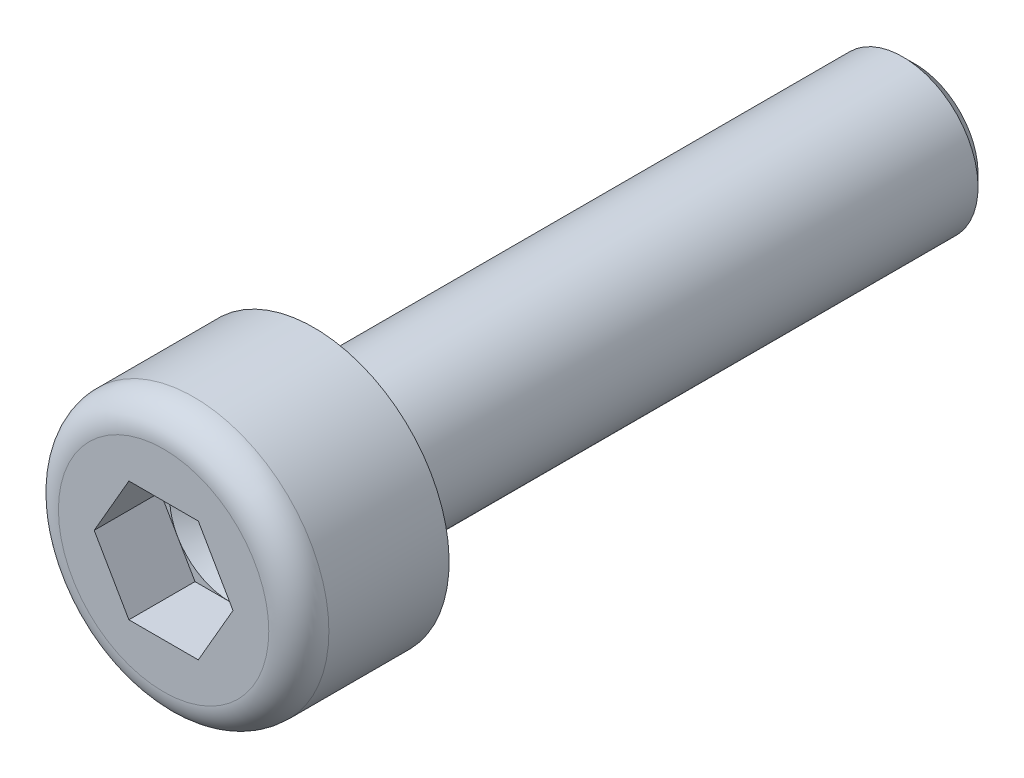
ISO-10303-21;
HEADER;
FILE_DESCRIPTION(('STEP AP214'),'2;1');
FILE_NAME('part.step','',(''),(''),'','','');
FILE_SCHEMA(('AUTOMOTIVE_DESIGN { 1 0 10303 214 1 1 1 1 }'));
ENDSEC;
DATA;
#1=APPLICATION_CONTEXT('core data for automotive mechanical design processes');
#2=APPLICATION_PROTOCOL_DEFINITION('international standard','automotive_design',2000,#1);
#3=PRODUCT_CONTEXT('',#1,'mechanical');
#4=PRODUCT('Part','Part','',(#3));
#5=PRODUCT_RELATED_PRODUCT_CATEGORY('part','',(#4));
#6=PRODUCT_DEFINITION_FORMATION('','',#4);
#7=PRODUCT_DEFINITION_CONTEXT('part definition',#1,'design');
#8=PRODUCT_DEFINITION('design','',#6,#7);
#9=PRODUCT_DEFINITION_SHAPE('','',#8);
#10=(LENGTH_UNIT() NAMED_UNIT(*) SI_UNIT(.MILLI.,.METRE.));
#11=(NAMED_UNIT(*) PLANE_ANGLE_UNIT() SI_UNIT($,.RADIAN.));
#12=(NAMED_UNIT(*) SI_UNIT($,.STERADIAN.) SOLID_ANGLE_UNIT());
#13=UNCERTAINTY_MEASURE_WITH_UNIT(LENGTH_MEASURE(1.E-05),#10,'distance_accuracy_value','');
#14=(GEOMETRIC_REPRESENTATION_CONTEXT(3) GLOBAL_UNCERTAINTY_ASSIGNED_CONTEXT((#13)) GLOBAL_UNIT_ASSIGNED_CONTEXT((#10,
#11,#12)) REPRESENTATION_CONTEXT('',''));
#15=CARTESIAN_POINT('',(0.,0.,0.));
#16=DIRECTION('',(0.,0.,1.));
#17=DIRECTION('',(1.,0.,0.));
#18=AXIS2_PLACEMENT_3D('',#15,#16,#17);
#19=CARTESIAN_POINT('',(0.,0.,-1.10000000000421));
#20=DIRECTION('',(0.,0.,1.));
#21=DIRECTION('',(0.,-1.,0.));
#22=AXIS2_PLACEMENT_3D('',#19,#20,#21);
#23=CONICAL_SURFACE('',#22,1.00000000000233,1.04719755119637);
#24=CARTESIAN_POINT('',(0.,1.11022302462516E-13,-1.67735026919519));
#25=VERTEX_POINT('',#24);
#26=VERTEX_LOOP('',#25);
#27=FACE_BOUND('',#26,.T.);
#28=CARTESIAN_POINT('',(0.,0.,-1.10000000000408));
#29=DIRECTION('',(0.,0.,1.));
#30=DIRECTION('',(0.,-1.,0.));
#31=AXIS2_PLACEMENT_3D('',#28,#29,#30);
#32=CIRCLE('',#31,1.00000000000255);
#33=CARTESIAN_POINT('',(0.,1.00000000000132,-1.10000000000204));
#34=VERTEX_POINT('',#33);
#35=CARTESIAN_POINT('',(0.866025403785388,0.500000000000646,-1.10000000000211));
#36=VERTEX_POINT('',#35);
#37=EDGE_CURVE('E84',#34,#36,#32,.F.);
#38=ORIENTED_EDGE('',*,*,#37,.F.);
#39=CARTESIAN_POINT('',(0.,0.,-1.10000000000408));
#40=DIRECTION('',(0.,0.,1.));
#41=DIRECTION('',(0.,-1.,0.));
#42=AXIS2_PLACEMENT_3D('',#39,#40,#41);
#43=CIRCLE('',#42,1.00000000000255);
#44=CARTESIAN_POINT('',(-0.866025403785583,0.500000000000678,-1.10000000000204));
#45=VERTEX_POINT('',#44);
#46=EDGE_CURVE('E141',#45,#34,#43,.F.);
#47=ORIENTED_EDGE('',*,*,#46,.F.);
#48=CARTESIAN_POINT('',(0.,0.,-1.10000000000408));
#49=DIRECTION('',(0.,0.,1.));
#50=DIRECTION('',(0.,-1.,0.));
#51=AXIS2_PLACEMENT_3D('',#48,#49,#50);
#52=CIRCLE('',#51,1.00000000000255);
#53=CARTESIAN_POINT('',(-0.866025403785612,-0.500000000000564,-1.10000000000204));
#54=VERTEX_POINT('',#53);
#55=EDGE_CURVE('E127',#54,#45,#52,.F.);
#56=ORIENTED_EDGE('',*,*,#55,.F.);
#57=CARTESIAN_POINT('',(0.,0.,-1.10000000000421));
#58=DIRECTION('',(0.,0.,1.));
#59=DIRECTION('',(0.,-1.,0.));
#60=AXIS2_PLACEMENT_3D('',#57,#58,#59);
#61=CIRCLE('',#60,1.00000000000233);
#62=CARTESIAN_POINT('',(0.,-1.00000000000116,-1.10000000000211));
#63=VERTEX_POINT('',#62);
#64=EDGE_CURVE('E143',#63,#54,#61,.F.);
#65=ORIENTED_EDGE('',*,*,#64,.F.);
#66=CARTESIAN_POINT('',(0.,0.,-1.10000000000421));
#67=DIRECTION('',(0.,0.,1.));
#68=DIRECTION('',(0.,-1.,0.));
#69=AXIS2_PLACEMENT_3D('',#66,#67,#68);
#70=CIRCLE('',#69,1.00000000000233);
#71=CARTESIAN_POINT('',(0.866025403785432,-0.500000000000564,-1.10000000000211));
#72=VERTEX_POINT('',#71);
#73=EDGE_CURVE('E90',#72,#63,#70,.F.);
#74=ORIENTED_EDGE('',*,*,#73,.F.);
#75=CARTESIAN_POINT('',(0.,0.,-1.10000000000421));
#76=DIRECTION('',(0.,0.,1.));
#77=DIRECTION('',(0.,-1.,0.));
#78=AXIS2_PLACEMENT_3D('',#75,#76,#77);
#79=CIRCLE('',#78,1.00000000000233);
#80=EDGE_CURVE('E87',#36,#72,#79,.F.);
#81=ORIENTED_EDGE('',*,*,#80,.F.);
#82=EDGE_LOOP('',(#38,#47,#56,#65,#74,#81));
#83=FACE_BOUND('',#82,.T.);
#84=ADVANCED_FACE('F17',(#27,#83),#23,.F.);
#85=CARTESIAN_POINT('',(0.,0.,-1.1));
#86=DIRECTION('',(0.,0.,1.));
#87=DIRECTION('',(0.,-1.,0.));
#88=AXIS2_PLACEMENT_3D('',#85,#86,#87);
#89=PLANE('',#88);
#90=ORIENTED_EDGE('',*,*,#37,.T.);
#91=DIRECTION('',(-0.5,0.866025403784439,0.));
#92=VECTOR('',#91,1.);
#93=CARTESIAN_POINT('',(1.15470053837918,0.,-1.1));
#94=LINE('',#93,#92);
#95=CARTESIAN_POINT('',(0.577350269189541,1.00000000000007,-1.1));
#96=VERTEX_POINT('',#95);
#97=EDGE_CURVE('E103',#36,#96,#94,.T.);
#98=ORIENTED_EDGE('',*,*,#97,.T.);
#99=DIRECTION('',(-1.,0.,0.));
#100=VECTOR('',#99,1.);
#101=CARTESIAN_POINT('',(0.57735026918956,1.00000000000008,-1.1));
#102=LINE('',#101,#100);
#103=EDGE_CURVE('E109',#96,#34,#102,.T.);
#104=ORIENTED_EDGE('',*,*,#103,.T.);
#105=EDGE_LOOP('',(#90,#98,#104));
#106=FACE_BOUND('',#105,.T.);
#107=ADVANCED_FACE('F107',(#106),#89,.T.);
#108=CARTESIAN_POINT('',(0.,0.,-1.1));
#109=DIRECTION('',(0.,0.,1.));
#110=DIRECTION('',(0.,-1.,0.));
#111=AXIS2_PLACEMENT_3D('',#108,#109,#110);
#112=PLANE('',#111);
#113=ORIENTED_EDGE('',*,*,#80,.T.);
#114=DIRECTION('',(0.500000000000001,0.866025403784438,0.));
#115=VECTOR('',#114,1.);
#116=CARTESIAN_POINT('',(0.577350269189581,-0.99999999999998,-1.1));
#117=LINE('',#116,#115);
#118=CARTESIAN_POINT('',(1.1547005383792,0.,-1.1));
#119=VERTEX_POINT('',#118);
#120=EDGE_CURVE('E98',#72,#119,#117,.T.);
#121=ORIENTED_EDGE('',*,*,#120,.T.);
#122=DIRECTION('',(-0.5,0.866025403784439,0.));
#123=VECTOR('',#122,1.);
#124=CARTESIAN_POINT('',(1.15470053837918,0.,-1.1));
#125=LINE('',#124,#123);
#126=EDGE_CURVE('E96',#119,#36,#125,.T.);
#127=ORIENTED_EDGE('',*,*,#126,.T.);
#128=EDGE_LOOP('',(#113,#121,#127));
#129=FACE_BOUND('',#128,.T.);
#130=ADVANCED_FACE('F97',(#129),#112,.T.);
#131=CARTESIAN_POINT('',(0.,0.,-1.1));
#132=DIRECTION('',(0.,0.,1.));
#133=DIRECTION('',(0.,-1.,0.));
#134=AXIS2_PLACEMENT_3D('',#131,#132,#133);
#135=PLANE('',#134);
#136=ORIENTED_EDGE('',*,*,#73,.T.);
#137=DIRECTION('',(1.,0.,0.));
#138=VECTOR('',#137,1.);
#139=CARTESIAN_POINT('',(-0.577350269189668,-0.99999999999999,-1.1));
#140=LINE('',#139,#138);
#141=CARTESIAN_POINT('',(0.577350269189588,-0.999999999999983,-1.1));
#142=VERTEX_POINT('',#141);
#143=EDGE_CURVE('E249',#63,#142,#140,.T.);
#144=ORIENTED_EDGE('',*,*,#143,.T.);
#145=DIRECTION('',(0.500000000000001,0.866025403784438,0.));
#146=VECTOR('',#145,1.);
#147=CARTESIAN_POINT('',(0.577350269189581,-0.99999999999998,-1.1));
#148=LINE('',#147,#146);
#149=EDGE_CURVE('E118',#142,#72,#148,.T.);
#150=ORIENTED_EDGE('',*,*,#149,.T.);
#151=EDGE_LOOP('',(#136,#144,#150));
#152=FACE_BOUND('',#151,.T.);
#153=ADVANCED_FACE('F302',(#152),#135,.T.);
#154=CARTESIAN_POINT('',(0.,0.,-1.1));
#155=DIRECTION('',(0.,0.,1.));
#156=DIRECTION('',(0.,-1.,0.));
#157=AXIS2_PLACEMENT_3D('',#154,#155,#156);
#158=PLANE('',#157);
#159=ORIENTED_EDGE('',*,*,#64,.T.);
#160=DIRECTION('',(0.499999999999999,-0.866025403784439,0.));
#161=VECTOR('',#160,1.);
#162=CARTESIAN_POINT('',(-1.15470053837933,0.,-1.1));
#163=LINE('',#162,#161);
#164=CARTESIAN_POINT('',(-0.577350269189676,-0.999999999999993,-1.1));
#165=VERTEX_POINT('',#164);
#166=EDGE_CURVE('E219',#54,#165,#163,.T.);
#167=ORIENTED_EDGE('',*,*,#166,.T.);
#168=DIRECTION('',(1.,0.,0.));
#169=VECTOR('',#168,1.);
#170=CARTESIAN_POINT('',(-0.577350269189668,-0.99999999999999,-1.1));
#171=LINE('',#170,#169);
#172=EDGE_CURVE('E246',#165,#63,#171,.T.);
#173=ORIENTED_EDGE('',*,*,#172,.T.);
#174=EDGE_LOOP('',(#159,#167,#173));
#175=FACE_BOUND('',#174,.T.);
#176=ADVANCED_FACE('F297',(#175),#158,.T.);
#177=CARTESIAN_POINT('',(0.,0.,-1.1));
#178=DIRECTION('',(0.,0.,1.));
#179=DIRECTION('',(0.,-1.,0.));
#180=AXIS2_PLACEMENT_3D('',#177,#178,#179);
#181=PLANE('',#180);
#182=ORIENTED_EDGE('',*,*,#46,.T.);
#183=DIRECTION('',(-1.,0.,0.));
#184=VECTOR('',#183,1.);
#185=CARTESIAN_POINT('',(0.57735026918956,1.00000000000008,-1.1));
#186=LINE('',#185,#184);
#187=CARTESIAN_POINT('',(-0.57735026918971,1.00000000000008,-1.1));
#188=VERTEX_POINT('',#187);
#189=EDGE_CURVE('E104',#34,#188,#186,.T.);
#190=ORIENTED_EDGE('',*,*,#189,.T.);
#191=DIRECTION('',(-0.5,-0.866025403784439,0.));
#192=VECTOR('',#191,1.);
#193=CARTESIAN_POINT('',(-0.57735026918972,1.00000000000005,-1.1));
#194=LINE('',#193,#192);
#195=EDGE_CURVE('E200',#188,#45,#194,.T.);
#196=ORIENTED_EDGE('',*,*,#195,.T.);
#197=EDGE_LOOP('',(#182,#190,#196));
#198=FACE_BOUND('',#197,.T.);
#199=ADVANCED_FACE('F290',(#198),#181,.T.);
#200=CARTESIAN_POINT('',(0.,0.,-1.1));
#201=DIRECTION('',(0.,0.,1.));
#202=DIRECTION('',(0.,-1.,0.));
#203=AXIS2_PLACEMENT_3D('',#200,#201,#202);
#204=PLANE('',#203);
#205=ORIENTED_EDGE('',*,*,#55,.T.);
#206=DIRECTION('',(-0.5,-0.866025403784439,0.));
#207=VECTOR('',#206,1.);
#208=CARTESIAN_POINT('',(-0.57735026918972,1.00000000000005,-1.1));
#209=LINE('',#208,#207);
#210=CARTESIAN_POINT('',(-1.15470053837934,0.,-1.1));
#211=VERTEX_POINT('',#210);
#212=EDGE_CURVE('E208',#45,#211,#209,.T.);
#213=ORIENTED_EDGE('',*,*,#212,.T.);
#214=DIRECTION('',(0.499999999999999,-0.866025403784439,0.));
#215=VECTOR('',#214,1.);
#216=CARTESIAN_POINT('',(-1.15470053837933,0.,-1.1));
#217=LINE('',#216,#215);
#218=EDGE_CURVE('E216',#211,#54,#217,.T.);
#219=ORIENTED_EDGE('',*,*,#218,.T.);
#220=EDGE_LOOP('',(#205,#213,#219));
#221=FACE_BOUND('',#220,.T.);
#222=ADVANCED_FACE('F292',(#221),#204,.T.);
#223=CARTESIAN_POINT('',(0.57735026918956,1.00000000000008,-1.1));
#224=DIRECTION('',(0.,1.,0.));
#225=DIRECTION('',(-1.,0.,0.));
#226=AXIS2_PLACEMENT_3D('',#223,#224,#225);
#227=PLANE('',#226);
#228=DIRECTION('',(0.,0.,1.));
#229=VECTOR('',#228,1.);
#230=CARTESIAN_POINT('',(-0.577350269189705,1.00000000000007,-1.1));
#231=LINE('',#230,#229);
#232=CARTESIAN_POINT('',(-0.577350269189705,1.00000000000007,0.));
#233=VERTEX_POINT('',#232);
#234=EDGE_CURVE('E209',#233,#188,#231,.F.);
#235=ORIENTED_EDGE('',*,*,#234,.T.);
#236=ORIENTED_EDGE('',*,*,#189,.F.);
#237=ORIENTED_EDGE('',*,*,#103,.F.);
#238=DIRECTION('',(0.,0.,1.));
#239=VECTOR('',#238,1.);
#240=CARTESIAN_POINT('',(0.577350269189536,1.00000000000007,-1.1));
#241=LINE('',#240,#239);
#242=CARTESIAN_POINT('',(0.577350269189577,1.00000000000007,0.));
#243=VERTEX_POINT('',#242);
#244=EDGE_CURVE('E116',#96,#243,#241,.T.);
#245=ORIENTED_EDGE('',*,*,#244,.T.);
#246=DIRECTION('',(1.,0.,0.));
#247=VECTOR('',#246,1.);
#248=CARTESIAN_POINT('',(0.,1.00000000000004,0.));
#249=LINE('',#248,#247);
#250=EDGE_CURVE('E195',#233,#243,#249,.T.);
#251=ORIENTED_EDGE('',*,*,#250,.F.);
#252=EDGE_LOOP('',(#235,#236,#237,#245,#251));
#253=FACE_BOUND('',#252,.T.);
#254=ADVANCED_FACE('F283',(#253),#227,.F.);
#255=CARTESIAN_POINT('',(1.15470053837918,0.,-1.1));
#256=DIRECTION('',(0.866025403784439,0.5,0.));
#257=DIRECTION('',(-0.5,0.866025403784439,0.));
#258=AXIS2_PLACEMENT_3D('',#255,#256,#257);
#259=PLANE('',#258);
#260=ORIENTED_EDGE('',*,*,#244,.F.);
#261=ORIENTED_EDGE('',*,*,#97,.F.);
#262=ORIENTED_EDGE('',*,*,#126,.F.);
#263=DIRECTION('',(0.,0.,1.));
#264=VECTOR('',#263,1.);
#265=CARTESIAN_POINT('',(1.15470053837921,0.,-1.1));
#266=LINE('',#265,#264);
#267=CARTESIAN_POINT('',(1.15470053837919,0.,0.));
#268=VERTEX_POINT('',#267);
#269=EDGE_CURVE('E250',#119,#268,#266,.T.);
#270=ORIENTED_EDGE('',*,*,#269,.T.);
#271=DIRECTION('',(0.49999999999998,-0.86602540378445,0.));
#272=VECTOR('',#271,1.);
#273=CARTESIAN_POINT('',(0.577350269189581,1.00000000000009,0.));
#274=LINE('',#273,#272);
#275=EDGE_CURVE('E193',#243,#268,#274,.T.);
#276=ORIENTED_EDGE('',*,*,#275,.F.);
#277=EDGE_LOOP('',(#260,#261,#262,#270,#276));
#278=FACE_BOUND('',#277,.T.);
#279=ADVANCED_FACE('F113',(#278),#259,.F.);
#280=CARTESIAN_POINT('',(0.577350269189581,-0.99999999999998,-1.1));
#281=DIRECTION('',(0.866025403784438,-0.500000000000001,0.));
#282=DIRECTION('',(0.500000000000001,0.866025403784438,0.));
#283=AXIS2_PLACEMENT_3D('',#280,#281,#282);
#284=PLANE('',#283);
#285=ORIENTED_EDGE('',*,*,#269,.F.);
#286=ORIENTED_EDGE('',*,*,#120,.F.);
#287=ORIENTED_EDGE('',*,*,#149,.F.);
#288=DIRECTION('',(0.,0.,1.));
#289=VECTOR('',#288,1.);
#290=CARTESIAN_POINT('',(0.577350269189581,-0.99999999999999,-1.1));
#291=LINE('',#290,#289);
#292=CARTESIAN_POINT('',(0.577350269189596,-0.999999999999943,0.));
#293=VERTEX_POINT('',#292);
#294=EDGE_CURVE('E220',#142,#293,#291,.T.);
#295=ORIENTED_EDGE('',*,*,#294,.T.);
#296=DIRECTION('',(-0.500000000000003,-0.866025403784437,0.));
#297=VECTOR('',#296,1.);
#298=CARTESIAN_POINT('',(1.1547005383792,0.,0.));
#299=LINE('',#298,#297);
#300=EDGE_CURVE('E190',#268,#293,#299,.T.);
#301=ORIENTED_EDGE('',*,*,#300,.F.);
#302=EDGE_LOOP('',(#285,#286,#287,#295,#301));
#303=FACE_BOUND('',#302,.T.);
#304=ADVANCED_FACE('F276',(#303),#284,.F.);
#305=CARTESIAN_POINT('',(-0.577350269189668,-0.99999999999999,-1.1));
#306=DIRECTION('',(0.,-1.,0.));
#307=DIRECTION('',(1.,0.,0.));
#308=AXIS2_PLACEMENT_3D('',#305,#306,#307);
#309=PLANE('',#308);
#310=ORIENTED_EDGE('',*,*,#294,.F.);
#311=ORIENTED_EDGE('',*,*,#143,.F.);
#312=ORIENTED_EDGE('',*,*,#172,.F.);
#313=DIRECTION('',(0.,0.,1.));
#314=VECTOR('',#313,1.);
#315=CARTESIAN_POINT('',(-0.577350269189677,-0.999999999999996,-1.1));
#316=LINE('',#315,#314);
#317=CARTESIAN_POINT('',(-0.577350269189679,-0.999999999999974,0.));
#318=VERTEX_POINT('',#317);
#319=EDGE_CURVE('E229',#165,#318,#316,.T.);
#320=ORIENTED_EDGE('',*,*,#319,.T.);
#321=DIRECTION('',(1.,0.,0.));
#322=VECTOR('',#321,1.);
#323=CARTESIAN_POINT('',(0.,-0.999999999999918,0.));
#324=LINE('',#323,#322);
#325=EDGE_CURVE('E187',#293,#318,#324,.F.);
#326=ORIENTED_EDGE('',*,*,#325,.F.);
#327=EDGE_LOOP('',(#310,#311,#312,#320,#326));
#328=FACE_BOUND('',#327,.T.);
#329=ADVANCED_FACE('F303',(#328),#309,.F.);
#330=CARTESIAN_POINT('',(-1.15470053837933,0.,-1.1));
#331=DIRECTION('',(-0.866025403784439,-0.499999999999999,0.));
#332=DIRECTION('',(0.499999999999999,-0.866025403784439,0.));
#333=AXIS2_PLACEMENT_3D('',#330,#331,#332);
#334=PLANE('',#333);
#335=ORIENTED_EDGE('',*,*,#319,.F.);
#336=ORIENTED_EDGE('',*,*,#166,.F.);
#337=ORIENTED_EDGE('',*,*,#218,.F.);
#338=DIRECTION('',(0.,0.,1.));
#339=VECTOR('',#338,1.);
#340=CARTESIAN_POINT('',(-1.15470053837934,0.,-1.1));
#341=LINE('',#340,#339);
#342=CARTESIAN_POINT('',(-1.15470053837932,0.,0.));
#343=VERTEX_POINT('',#342);
#344=EDGE_CURVE('E213',#211,#343,#341,.T.);
#345=ORIENTED_EDGE('',*,*,#344,.T.);
#346=DIRECTION('',(-0.500000000000003,0.866025403784437,0.));
#347=VECTOR('',#346,1.);
#348=CARTESIAN_POINT('',(-0.577350269189675,-0.999999999999945,0.));
#349=LINE('',#348,#347);
#350=EDGE_CURVE('E179',#318,#343,#349,.T.);
#351=ORIENTED_EDGE('',*,*,#350,.F.);
#352=EDGE_LOOP('',(#335,#336,#337,#345,#351));
#353=FACE_BOUND('',#352,.T.);
#354=ADVANCED_FACE('F310',(#353),#334,.F.);
#355=CARTESIAN_POINT('',(-0.57735026918972,1.00000000000005,-1.1));
#356=DIRECTION('',(-0.866025403784439,0.5,0.));
#357=DIRECTION('',(-0.5,-0.866025403784439,0.));
#358=AXIS2_PLACEMENT_3D('',#355,#356,#357);
#359=PLANE('',#358);
#360=ORIENTED_EDGE('',*,*,#344,.F.);
#361=ORIENTED_EDGE('',*,*,#212,.F.);
#362=ORIENTED_EDGE('',*,*,#195,.F.);
#363=ORIENTED_EDGE('',*,*,#234,.F.);
#364=DIRECTION('',(0.500000000000021,0.866025403784427,0.));
#365=VECTOR('',#364,1.);
#366=CARTESIAN_POINT('',(-1.1547005383793,0.,0.));
#367=LINE('',#366,#365);
#368=EDGE_CURVE('E151',#343,#233,#367,.T.);
#369=ORIENTED_EDGE('',*,*,#368,.F.);
#370=EDGE_LOOP('',(#360,#361,#362,#363,#369));
#371=FACE_BOUND('',#370,.T.);
#372=ADVANCED_FACE('F170',(#371),#359,.F.);
#373=CARTESIAN_POINT('',(0.,0.,0.));
#374=DIRECTION('',(0.,0.,1.));
#375=DIRECTION('',(0.,-1.,0.));
#376=AXIS2_PLACEMENT_3D('',#373,#374,#375);
#377=PLANE('',#376);
#378=ORIENTED_EDGE('',*,*,#350,.T.);
#379=ORIENTED_EDGE('',*,*,#368,.T.);
#380=ORIENTED_EDGE('',*,*,#250,.T.);
#381=ORIENTED_EDGE('',*,*,#275,.T.);
#382=ORIENTED_EDGE('',*,*,#300,.T.);
#383=ORIENTED_EDGE('',*,*,#325,.T.);
#384=EDGE_LOOP('',(#378,#379,#380,#381,#382,#383));
#385=FACE_BOUND('',#384,.T.);
#386=CARTESIAN_POINT('',(0.,0.,0.));
#387=DIRECTION('',(0.,0.,-1.));
#388=DIRECTION('',(-1.,0.,0.));
#389=AXIS2_PLACEMENT_3D('',#386,#387,#388);
#390=CIRCLE('',#389,1.75);
#391=CARTESIAN_POINT('',(-1.75,0.,0.));
#392=VERTEX_POINT('',#391);
#393=CARTESIAN_POINT('',(1.75,0.,0.));
#394=VERTEX_POINT('',#393);
#395=EDGE_CURVE('E149',#392,#394,#390,.T.);
#396=ORIENTED_EDGE('',*,*,#395,.F.);
#397=CARTESIAN_POINT('',(0.,0.,0.));
#398=DIRECTION('',(0.,0.,-1.));
#399=DIRECTION('',(1.,0.,0.));
#400=AXIS2_PLACEMENT_3D('',#397,#398,#399);
#401=CIRCLE('',#400,1.75);
#402=EDGE_CURVE('E36',#394,#392,#401,.T.);
#403=ORIENTED_EDGE('',*,*,#402,.F.);
#404=EDGE_LOOP('',(#396,#403));
#405=FACE_BOUND('',#404,.T.);
#406=ADVANCED_FACE('F153',(#385,#405),#377,.T.);
#407=CARTESIAN_POINT('',(0.,0.,-0.5));
#408=DIRECTION('',(0.,0.,1.));
#409=DIRECTION('',(1.,0.,0.));
#410=AXIS2_PLACEMENT_3D('',#407,#408,#409);
#411=TOROIDAL_SURFACE('',#410,1.75,0.5);
#412=ORIENTED_EDGE('',*,*,#402,.T.);
#413=ORIENTED_EDGE('',*,*,#395,.T.);
#414=EDGE_LOOP('',(#412,#413));
#415=FACE_BOUND('',#414,.T.);
#416=CARTESIAN_POINT('',(0.,0.,-0.5));
#417=DIRECTION('',(0.,0.,1.));
#418=DIRECTION('',(0.,-1.,0.));
#419=AXIS2_PLACEMENT_3D('',#416,#417,#418);
#420=CIRCLE('',#419,2.25);
#421=CARTESIAN_POINT('',(0.,-2.25,-0.5));
#422=VERTEX_POINT('',#421);
#423=EDGE_CURVE('E138',#422,#422,#420,.F.);
#424=ORIENTED_EDGE('',*,*,#423,.F.);
#425=EDGE_LOOP('',(#424));
#426=FACE_BOUND('',#425,.T.);
#427=ADVANCED_FACE('F147',(#415,#426),#411,.T.);
#428=CARTESIAN_POINT('',(0.,0.,-12.4999999999998));
#429=DIRECTION('',(0.,0.,-1.));
#430=DIRECTION('',(0.,1.,0.));
#431=AXIS2_PLACEMENT_3D('',#428,#429,#430);
#432=PLANE('',#431);
#433=CARTESIAN_POINT('',(0.,0.,-12.4999999999886));
#434=DIRECTION('',(0.,0.,1.));
#435=DIRECTION('',(0.,-1.,0.));
#436=AXIS2_PLACEMENT_3D('',#433,#434,#435);
#437=CIRCLE('',#436,1.05000000007749);
#438=CARTESIAN_POINT('',(0.,-1.0500000000774,-12.4999999999886));
#439=VERTEX_POINT('',#438);
#440=EDGE_CURVE('E135',#439,#439,#437,.T.);
#441=ORIENTED_EDGE('',*,*,#440,.F.);
#442=EDGE_LOOP('',(#441));
#443=FACE_BOUND('',#442,.T.);
#444=ADVANCED_FACE('F336',(#443),#432,.T.);
#445=CARTESIAN_POINT('',(0.,0.,-2.5));
#446=DIRECTION('',(0.,0.,1.));
#447=DIRECTION('',(0.,-1.,0.));
#448=AXIS2_PLACEMENT_3D('',#445,#446,#447);
#449=CYLINDRICAL_SURFACE('',#448,2.25);
#450=ORIENTED_EDGE('',*,*,#423,.T.);
#451=EDGE_LOOP('',(#450));
#452=FACE_BOUND('',#451,.T.);
#453=CARTESIAN_POINT('',(0.,0.,-2.5));
#454=DIRECTION('',(0.,0.,1.));
#455=DIRECTION('',(0.,-1.,0.));
#456=AXIS2_PLACEMENT_3D('',#453,#454,#455);
#457=CIRCLE('',#456,2.25);
#458=CARTESIAN_POINT('',(0.,-2.25,-2.5));
#459=VERTEX_POINT('',#458);
#460=EDGE_CURVE('E132',#459,#459,#457,.T.);
#461=ORIENTED_EDGE('',*,*,#460,.T.);
#462=EDGE_LOOP('',(#461));
#463=FACE_BOUND('',#462,.T.);
#464=ADVANCED_FACE('F333',(#452,#463),#449,.T.);
#465=CARTESIAN_POINT('',(0.,0.,-12.3000000000957));
#466=DIRECTION('',(0.,0.,1.));
#467=DIRECTION('',(0.,-1.,0.));
#468=AXIS2_PLACEMENT_3D('',#465,#466,#467);
#469=CONICAL_SURFACE('',#468,1.2499999999136,0.78539816325534);
#470=CARTESIAN_POINT('',(0.,0.,-12.2999999999998));
#471=DIRECTION('',(0.,0.,1.));
#472=DIRECTION('',(0.,-1.,0.));
#473=AXIS2_PLACEMENT_3D('',#470,#471,#472);
#474=CIRCLE('',#473,1.25);
#475=CARTESIAN_POINT('',(0.,-1.24999999999991,-12.2999999999998));
#476=VERTEX_POINT('',#475);
#477=EDGE_CURVE('E28',#476,#476,#474,.T.);
#478=ORIENTED_EDGE('',*,*,#477,.F.);
#479=EDGE_LOOP('',(#478));
#480=FACE_BOUND('',#479,.T.);
#481=ORIENTED_EDGE('',*,*,#440,.T.);
#482=EDGE_LOOP('',(#481));
#483=FACE_BOUND('',#482,.T.);
#484=ADVANCED_FACE('F326',(#480,#483),#469,.T.);
#485=CARTESIAN_POINT('',(0.,0.,-2.5));
#486=DIRECTION('',(0.,0.,1.));
#487=DIRECTION('',(0.,-1.,0.));
#488=AXIS2_PLACEMENT_3D('',#485,#486,#487);
#489=PLANE('',#488);
#490=ORIENTED_EDGE('',*,*,#460,.F.);
#491=EDGE_LOOP('',(#490));
#492=FACE_BOUND('',#491,.T.);
#493=CARTESIAN_POINT('',(0.,0.,-2.5));
#494=DIRECTION('',(0.,0.,1.));
#495=DIRECTION('',(0.,-1.,0.));
#496=AXIS2_PLACEMENT_3D('',#493,#494,#495);
#497=CIRCLE('',#496,1.25);
#498=CARTESIAN_POINT('',(0.,-1.24999999999991,-2.5));
#499=VERTEX_POINT('',#498);
#500=EDGE_CURVE('E11',#499,#499,#497,.F.);
#501=ORIENTED_EDGE('',*,*,#500,.F.);
#502=EDGE_LOOP('',(#501));
#503=FACE_BOUND('',#502,.T.);
#504=ADVANCED_FACE('F320',(#492,#503),#489,.F.);
#505=CARTESIAN_POINT('',(0.,0.,-12.4999999999998));
#506=DIRECTION('',(0.,0.,1.));
#507=DIRECTION('',(0.,-1.,0.));
#508=AXIS2_PLACEMENT_3D('',#505,#506,#507);
#509=CYLINDRICAL_SURFACE('',#508,1.25);
#510=ORIENTED_EDGE('',*,*,#500,.T.);
#511=EDGE_LOOP('',(#510));
#512=FACE_BOUND('',#511,.T.);
#513=ORIENTED_EDGE('',*,*,#477,.T.);
#514=EDGE_LOOP('',(#513));
#515=FACE_BOUND('',#514,.T.);
#516=ADVANCED_FACE('F318',(#512,#515),#509,.T.);
#517=CLOSED_SHELL('',(#84,#107,#130,#153,#176,#199,#222,#254,#279,#304,#329,#354,#372,#406,#427,
#444,#464,#484,#504,#516));
#518=MANIFOLD_SOLID_BREP('B1',#517);
#519=ADVANCED_BREP_SHAPE_REPRESENTATION('',(#18,#518),#14);
#520=SHAPE_DEFINITION_REPRESENTATION(#9,#519);
ENDSEC;
END-ISO-10303-21;
